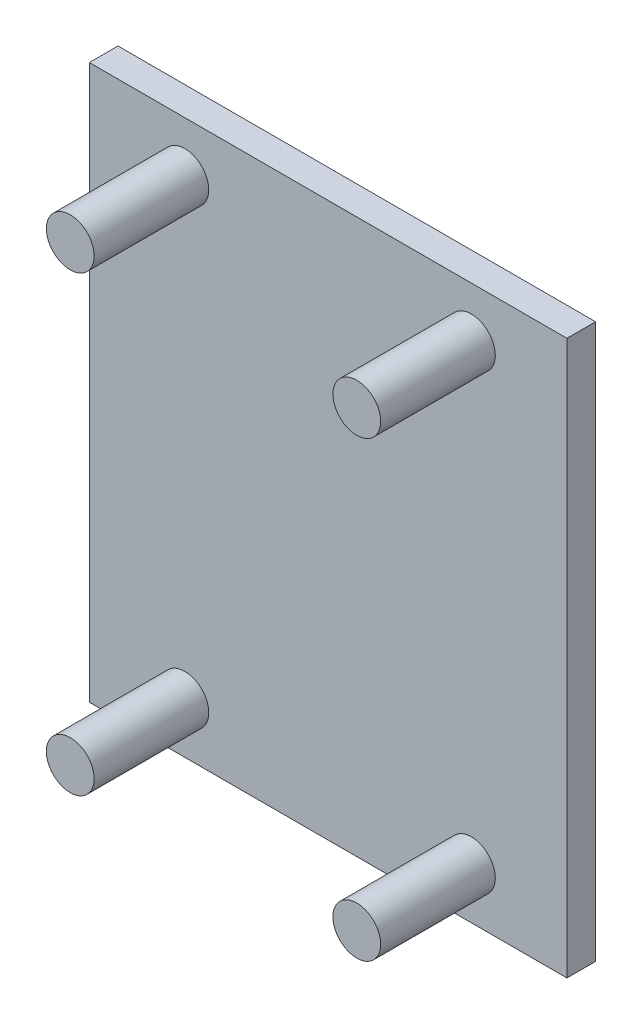
ISO-10303-21;
HEADER;
FILE_DESCRIPTION(('STEP AP214'),'2;1');
FILE_NAME('part.step','',(''),(''),'','','');
FILE_SCHEMA(('AUTOMOTIVE_DESIGN { 1 0 10303 214 1 1 1 1 }'));
ENDSEC;
DATA;
#1=APPLICATION_CONTEXT('core data for automotive mechanical design processes');
#2=APPLICATION_PROTOCOL_DEFINITION('international standard','automotive_design',2000,#1);
#3=PRODUCT_CONTEXT('',#1,'mechanical');
#4=PRODUCT('Part','Part','',(#3));
#5=PRODUCT_RELATED_PRODUCT_CATEGORY('part','',(#4));
#6=PRODUCT_DEFINITION_FORMATION('','',#4);
#7=PRODUCT_DEFINITION_CONTEXT('part definition',#1,'design');
#8=PRODUCT_DEFINITION('design','',#6,#7);
#9=PRODUCT_DEFINITION_SHAPE('','',#8);
#10=(LENGTH_UNIT() NAMED_UNIT(*) SI_UNIT(.MILLI.,.METRE.));
#11=(NAMED_UNIT(*) PLANE_ANGLE_UNIT() SI_UNIT($,.RADIAN.));
#12=(NAMED_UNIT(*) SI_UNIT($,.STERADIAN.) SOLID_ANGLE_UNIT());
#13=UNCERTAINTY_MEASURE_WITH_UNIT(LENGTH_MEASURE(1.E-05),#10,'distance_accuracy_value','');
#14=(GEOMETRIC_REPRESENTATION_CONTEXT(3) GLOBAL_UNCERTAINTY_ASSIGNED_CONTEXT((#13)) GLOBAL_UNIT_ASSIGNED_CONTEXT((#10,
#11,#12)) REPRESENTATION_CONTEXT('',''));
#15=CARTESIAN_POINT('',(0.,0.,0.));
#16=DIRECTION('',(0.,0.,1.));
#17=DIRECTION('',(1.,0.,0.));
#18=AXIS2_PLACEMENT_3D('',#15,#16,#17);
#19=CARTESIAN_POINT('',(-25.,29.,3.));
#20=DIRECTION('',(1.,0.,0.));
#21=DIRECTION('',(0.,0.,-1.));
#22=AXIS2_PLACEMENT_3D('',#19,#20,#21);
#23=PLANE('',#22);
#24=DIRECTION('',(0.,-1.,0.));
#25=VECTOR('',#24,1.);
#26=CARTESIAN_POINT('',(-25.,29.,0.));
#27=LINE('',#26,#25);
#28=CARTESIAN_POINT('',(-25.,29.,0.));
#29=VERTEX_POINT('',#28);
#30=CARTESIAN_POINT('',(-25.,-29.,0.));
#31=VERTEX_POINT('',#30);
#32=EDGE_CURVE('E100',#29,#31,#27,.T.);
#33=ORIENTED_EDGE('',*,*,#32,.T.);
#34=DIRECTION('',(0.,0.,-1.));
#35=VECTOR('',#34,1.);
#36=CARTESIAN_POINT('',(-25.,-29.,3.));
#37=LINE('',#36,#35);
#38=CARTESIAN_POINT('',(-25.,-29.,3.));
#39=VERTEX_POINT('',#38);
#40=EDGE_CURVE('E11',#39,#31,#37,.T.);
#41=ORIENTED_EDGE('',*,*,#40,.F.);
#42=DIRECTION('',(0.,-1.,0.));
#43=VECTOR('',#42,1.);
#44=CARTESIAN_POINT('',(-25.,29.,3.));
#45=LINE('',#44,#43);
#46=CARTESIAN_POINT('',(-25.,29.,3.));
#47=VERTEX_POINT('',#46);
#48=EDGE_CURVE('E88',#47,#39,#45,.T.);
#49=ORIENTED_EDGE('',*,*,#48,.F.);
#50=DIRECTION('',(0.,0.,-1.));
#51=VECTOR('',#50,1.);
#52=CARTESIAN_POINT('',(-25.,29.,3.));
#53=LINE('',#52,#51);
#54=EDGE_CURVE('E96',#47,#29,#53,.T.);
#55=ORIENTED_EDGE('',*,*,#54,.T.);
#56=EDGE_LOOP('',(#33,#41,#49,#55));
#57=FACE_BOUND('',#56,.T.);
#58=ADVANCED_FACE('F37',(#57),#23,.F.);
#59=CARTESIAN_POINT('',(-25.,-29.,3.));
#60=DIRECTION('',(0.,1.,0.));
#61=DIRECTION('',(0.,0.,1.));
#62=AXIS2_PLACEMENT_3D('',#59,#60,#61);
#63=PLANE('',#62);
#64=DIRECTION('',(1.,0.,0.));
#65=VECTOR('',#64,1.);
#66=CARTESIAN_POINT('',(-25.,-29.,0.));
#67=LINE('',#66,#65);
#68=CARTESIAN_POINT('',(25.,-29.,0.));
#69=VERTEX_POINT('',#68);
#70=EDGE_CURVE('E92',#31,#69,#67,.T.);
#71=ORIENTED_EDGE('',*,*,#70,.T.);
#72=DIRECTION('',(0.,0.,-1.));
#73=VECTOR('',#72,1.);
#74=CARTESIAN_POINT('',(25.,-29.,3.));
#75=LINE('',#74,#73);
#76=CARTESIAN_POINT('',(25.,-29.,3.));
#77=VERTEX_POINT('',#76);
#78=EDGE_CURVE('E45',#77,#69,#75,.T.);
#79=ORIENTED_EDGE('',*,*,#78,.F.);
#80=DIRECTION('',(1.,0.,0.));
#81=VECTOR('',#80,1.);
#82=CARTESIAN_POINT('',(-25.,-29.,3.));
#83=LINE('',#82,#81);
#84=EDGE_CURVE('E83',#39,#77,#83,.T.);
#85=ORIENTED_EDGE('',*,*,#84,.F.);
#86=ORIENTED_EDGE('',*,*,#40,.T.);
#87=EDGE_LOOP('',(#71,#79,#85,#86));
#88=FACE_BOUND('',#87,.T.);
#89=ADVANCED_FACE('F91',(#88),#63,.F.);
#90=CARTESIAN_POINT('',(25.,-29.,3.));
#91=DIRECTION('',(-1.,0.,0.));
#92=DIRECTION('',(0.,0.,1.));
#93=AXIS2_PLACEMENT_3D('',#90,#91,#92);
#94=PLANE('',#93);
#95=DIRECTION('',(0.,1.,0.));
#96=VECTOR('',#95,1.);
#97=CARTESIAN_POINT('',(25.,-29.,0.));
#98=LINE('',#97,#96);
#99=CARTESIAN_POINT('',(25.,29.,0.));
#100=VERTEX_POINT('',#99);
#101=EDGE_CURVE('E70',#69,#100,#98,.T.);
#102=ORIENTED_EDGE('',*,*,#101,.T.);
#103=DIRECTION('',(0.,0.,-1.));
#104=VECTOR('',#103,1.);
#105=CARTESIAN_POINT('',(25.,29.,3.));
#106=LINE('',#105,#104);
#107=CARTESIAN_POINT('',(25.,29.,3.));
#108=VERTEX_POINT('',#107);
#109=EDGE_CURVE('E93',#108,#100,#106,.T.);
#110=ORIENTED_EDGE('',*,*,#109,.F.);
#111=DIRECTION('',(0.,1.,0.));
#112=VECTOR('',#111,1.);
#113=CARTESIAN_POINT('',(25.,-29.,3.));
#114=LINE('',#113,#112);
#115=EDGE_CURVE('E86',#77,#108,#114,.T.);
#116=ORIENTED_EDGE('',*,*,#115,.F.);
#117=ORIENTED_EDGE('',*,*,#78,.T.);
#118=EDGE_LOOP('',(#102,#110,#116,#117));
#119=FACE_BOUND('',#118,.T.);
#120=ADVANCED_FACE('F94',(#119),#94,.F.);
#121=CARTESIAN_POINT('',(25.,29.,3.));
#122=DIRECTION('',(0.,-1.,0.));
#123=DIRECTION('',(0.,0.,-1.));
#124=AXIS2_PLACEMENT_3D('',#121,#122,#123);
#125=PLANE('',#124);
#126=DIRECTION('',(-1.,0.,0.));
#127=VECTOR('',#126,1.);
#128=CARTESIAN_POINT('',(25.,29.,0.));
#129=LINE('',#128,#127);
#130=EDGE_CURVE('E76',#100,#29,#129,.T.);
#131=ORIENTED_EDGE('',*,*,#130,.T.);
#132=ORIENTED_EDGE('',*,*,#54,.F.);
#133=DIRECTION('',(-1.,0.,0.));
#134=VECTOR('',#133,1.);
#135=CARTESIAN_POINT('',(25.,29.,3.));
#136=LINE('',#135,#134);
#137=EDGE_CURVE('E53',#108,#47,#136,.T.);
#138=ORIENTED_EDGE('',*,*,#137,.F.);
#139=ORIENTED_EDGE('',*,*,#109,.T.);
#140=EDGE_LOOP('',(#131,#132,#138,#139));
#141=FACE_BOUND('',#140,.T.);
#142=ADVANCED_FACE('F108',(#141),#125,.F.);
#143=CARTESIAN_POINT('',(0.,0.,3.));
#144=DIRECTION('',(0.,0.,1.));
#145=DIRECTION('',(1.,0.,0.));
#146=AXIS2_PLACEMENT_3D('',#143,#144,#145);
#147=PLANE('',#146);
#148=CARTESIAN_POINT('',(15.,23.7,3.));
#149=DIRECTION('',(0.,0.,1.));
#150=DIRECTION('',(1.,0.,0.));
#151=AXIS2_PLACEMENT_3D('',#148,#149,#150);
#152=CIRCLE('',#151,2.5);
#153=CARTESIAN_POINT('',(17.5,23.7,3.));
#154=VERTEX_POINT('',#153);
#155=EDGE_CURVE('E132',#154,#154,#152,.T.);
#156=ORIENTED_EDGE('',*,*,#155,.F.);
#157=EDGE_LOOP('',(#156));
#158=FACE_BOUND('',#157,.T.);
#159=CARTESIAN_POINT('',(15.,-23.7,3.));
#160=DIRECTION('',(0.,0.,1.));
#161=DIRECTION('',(1.,0.,0.));
#162=AXIS2_PLACEMENT_3D('',#159,#160,#161);
#163=CIRCLE('',#162,2.5);
#164=CARTESIAN_POINT('',(17.5,-23.7,3.));
#165=VERTEX_POINT('',#164);
#166=EDGE_CURVE('E126',#165,#165,#163,.T.);
#167=ORIENTED_EDGE('',*,*,#166,.F.);
#168=EDGE_LOOP('',(#167));
#169=FACE_BOUND('',#168,.T.);
#170=CARTESIAN_POINT('',(-15.,23.7,3.));
#171=DIRECTION('',(0.,0.,1.));
#172=DIRECTION('',(1.,0.,0.));
#173=AXIS2_PLACEMENT_3D('',#170,#171,#172);
#174=CIRCLE('',#173,2.5);
#175=CARTESIAN_POINT('',(-12.5,23.7,3.));
#176=VERTEX_POINT('',#175);
#177=EDGE_CURVE('E120',#176,#176,#174,.T.);
#178=ORIENTED_EDGE('',*,*,#177,.F.);
#179=EDGE_LOOP('',(#178));
#180=FACE_BOUND('',#179,.T.);
#181=CARTESIAN_POINT('',(-15.,-23.7,3.));
#182=DIRECTION('',(0.,0.,1.));
#183=DIRECTION('',(1.,0.,0.));
#184=AXIS2_PLACEMENT_3D('',#181,#182,#183);
#185=CIRCLE('',#184,2.5);
#186=CARTESIAN_POINT('',(-12.5,-23.7,3.));
#187=VERTEX_POINT('',#186);
#188=EDGE_CURVE('E114',#187,#187,#185,.T.);
#189=ORIENTED_EDGE('',*,*,#188,.F.);
#190=EDGE_LOOP('',(#189));
#191=FACE_BOUND('',#190,.T.);
#192=ORIENTED_EDGE('',*,*,#48,.T.);
#193=ORIENTED_EDGE('',*,*,#84,.T.);
#194=ORIENTED_EDGE('',*,*,#115,.T.);
#195=ORIENTED_EDGE('',*,*,#137,.T.);
#196=EDGE_LOOP('',(#192,#193,#194,#195));
#197=FACE_BOUND('',#196,.T.);
#198=ADVANCED_FACE('F84',(#158,#169,#180,#191,#197),#147,.T.);
#199=CARTESIAN_POINT('',(0.,0.,0.));
#200=DIRECTION('',(0.,0.,1.));
#201=DIRECTION('',(1.,0.,0.));
#202=AXIS2_PLACEMENT_3D('',#199,#200,#201);
#203=PLANE('',#202);
#204=ORIENTED_EDGE('',*,*,#32,.F.);
#205=ORIENTED_EDGE('',*,*,#130,.F.);
#206=ORIENTED_EDGE('',*,*,#101,.F.);
#207=ORIENTED_EDGE('',*,*,#70,.F.);
#208=EDGE_LOOP('',(#204,#205,#206,#207));
#209=FACE_BOUND('',#208,.T.);
#210=ADVANCED_FACE('F111',(#209),#203,.F.);
#211=CARTESIAN_POINT('',(-15.,-23.7,15.));
#212=DIRECTION('',(0.,0.,-1.));
#213=DIRECTION('',(-1.,0.,0.));
#214=AXIS2_PLACEMENT_3D('',#211,#212,#213);
#215=CYLINDRICAL_SURFACE('',#214,2.5);
#216=CARTESIAN_POINT('',(-15.,-23.7,15.));
#217=DIRECTION('',(0.,0.,1.));
#218=DIRECTION('',(1.,0.,0.));
#219=AXIS2_PLACEMENT_3D('',#216,#217,#218);
#220=CIRCLE('',#219,2.5);
#221=CARTESIAN_POINT('',(-12.5,-23.7,15.));
#222=VERTEX_POINT('',#221);
#223=EDGE_CURVE('E103',#222,#222,#220,.T.);
#224=ORIENTED_EDGE('',*,*,#223,.F.);
#225=EDGE_LOOP('',(#224));
#226=FACE_BOUND('',#225,.T.);
#227=ORIENTED_EDGE('',*,*,#188,.T.);
#228=EDGE_LOOP('',(#227));
#229=FACE_BOUND('',#228,.T.);
#230=ADVANCED_FACE('F156',(#226,#229),#215,.T.);
#231=CARTESIAN_POINT('',(-15.,-23.7,15.));
#232=DIRECTION('',(0.,0.,1.));
#233=DIRECTION('',(1.,0.,0.));
#234=AXIS2_PLACEMENT_3D('',#231,#232,#233);
#235=PLANE('',#234);
#236=ORIENTED_EDGE('',*,*,#223,.T.);
#237=EDGE_LOOP('',(#236));
#238=FACE_BOUND('',#237,.T.);
#239=ADVANCED_FACE('F158',(#238),#235,.T.);
#240=CARTESIAN_POINT('',(-15.,23.7,15.));
#241=DIRECTION('',(0.,0.,-1.));
#242=DIRECTION('',(-1.,0.,0.));
#243=AXIS2_PLACEMENT_3D('',#240,#241,#242);
#244=CYLINDRICAL_SURFACE('',#243,2.5);
#245=CARTESIAN_POINT('',(-15.,23.7,15.));
#246=DIRECTION('',(0.,0.,1.));
#247=DIRECTION('',(1.,0.,0.));
#248=AXIS2_PLACEMENT_3D('',#245,#246,#247);
#249=CIRCLE('',#248,2.5);
#250=CARTESIAN_POINT('',(-12.5,23.7,15.));
#251=VERTEX_POINT('',#250);
#252=EDGE_CURVE('E117',#251,#251,#249,.T.);
#253=ORIENTED_EDGE('',*,*,#252,.F.);
#254=EDGE_LOOP('',(#253));
#255=FACE_BOUND('',#254,.T.);
#256=ORIENTED_EDGE('',*,*,#177,.T.);
#257=EDGE_LOOP('',(#256));
#258=FACE_BOUND('',#257,.T.);
#259=ADVANCED_FACE('F165',(#255,#258),#244,.T.);
#260=CARTESIAN_POINT('',(-15.,23.7,15.));
#261=DIRECTION('',(0.,0.,1.));
#262=DIRECTION('',(1.,0.,0.));
#263=AXIS2_PLACEMENT_3D('',#260,#261,#262);
#264=PLANE('',#263);
#265=ORIENTED_EDGE('',*,*,#252,.T.);
#266=EDGE_LOOP('',(#265));
#267=FACE_BOUND('',#266,.T.);
#268=ADVANCED_FACE('F213',(#267),#264,.T.);
#269=CARTESIAN_POINT('',(15.,-23.7,15.));
#270=DIRECTION('',(0.,0.,-1.));
#271=DIRECTION('',(-1.,0.,0.));
#272=AXIS2_PLACEMENT_3D('',#269,#270,#271);
#273=CYLINDRICAL_SURFACE('',#272,2.5);
#274=CARTESIAN_POINT('',(15.,-23.7,15.));
#275=DIRECTION('',(0.,0.,1.));
#276=DIRECTION('',(1.,0.,0.));
#277=AXIS2_PLACEMENT_3D('',#274,#275,#276);
#278=CIRCLE('',#277,2.5);
#279=CARTESIAN_POINT('',(17.5,-23.7,15.));
#280=VERTEX_POINT('',#279);
#281=EDGE_CURVE('E123',#280,#280,#278,.T.);
#282=ORIENTED_EDGE('',*,*,#281,.F.);
#283=EDGE_LOOP('',(#282));
#284=FACE_BOUND('',#283,.T.);
#285=ORIENTED_EDGE('',*,*,#166,.T.);
#286=EDGE_LOOP('',(#285));
#287=FACE_BOUND('',#286,.T.);
#288=ADVANCED_FACE('F222',(#284,#287),#273,.T.);
#289=CARTESIAN_POINT('',(15.,-23.7,15.));
#290=DIRECTION('',(0.,0.,1.));
#291=DIRECTION('',(1.,0.,0.));
#292=AXIS2_PLACEMENT_3D('',#289,#290,#291);
#293=PLANE('',#292);
#294=ORIENTED_EDGE('',*,*,#281,.T.);
#295=EDGE_LOOP('',(#294));
#296=FACE_BOUND('',#295,.T.);
#297=ADVANCED_FACE('F143',(#296),#293,.T.);
#298=CARTESIAN_POINT('',(15.,23.7,15.));
#299=DIRECTION('',(0.,0.,-1.));
#300=DIRECTION('',(-1.,0.,0.));
#301=AXIS2_PLACEMENT_3D('',#298,#299,#300);
#302=CYLINDRICAL_SURFACE('',#301,2.5);
#303=CARTESIAN_POINT('',(15.,23.7,15.));
#304=DIRECTION('',(0.,0.,1.));
#305=DIRECTION('',(1.,0.,0.));
#306=AXIS2_PLACEMENT_3D('',#303,#304,#305);
#307=CIRCLE('',#306,2.5);
#308=CARTESIAN_POINT('',(17.5,23.7,15.));
#309=VERTEX_POINT('',#308);
#310=EDGE_CURVE('E129',#309,#309,#307,.T.);
#311=ORIENTED_EDGE('',*,*,#310,.F.);
#312=EDGE_LOOP('',(#311));
#313=FACE_BOUND('',#312,.T.);
#314=ORIENTED_EDGE('',*,*,#155,.T.);
#315=EDGE_LOOP('',(#314));
#316=FACE_BOUND('',#315,.T.);
#317=ADVANCED_FACE('F140',(#313,#316),#302,.T.);
#318=CARTESIAN_POINT('',(15.,23.7,15.));
#319=DIRECTION('',(0.,0.,1.));
#320=DIRECTION('',(1.,0.,0.));
#321=AXIS2_PLACEMENT_3D('',#318,#319,#320);
#322=PLANE('',#321);
#323=ORIENTED_EDGE('',*,*,#310,.T.);
#324=EDGE_LOOP('',(#323));
#325=FACE_BOUND('',#324,.T.);
#326=ADVANCED_FACE('F138',(#325),#322,.T.);
#327=CLOSED_SHELL('',(#58,#89,#120,#142,#198,#210,#230,#239,#259,#268,#288,#297,#317,#326));
#328=MANIFOLD_SOLID_BREP('B2',#327);
#329=ADVANCED_BREP_SHAPE_REPRESENTATION('',(#18,#328),#14);
#330=SHAPE_DEFINITION_REPRESENTATION(#9,#329);
ENDSEC;
END-ISO-10303-21;
